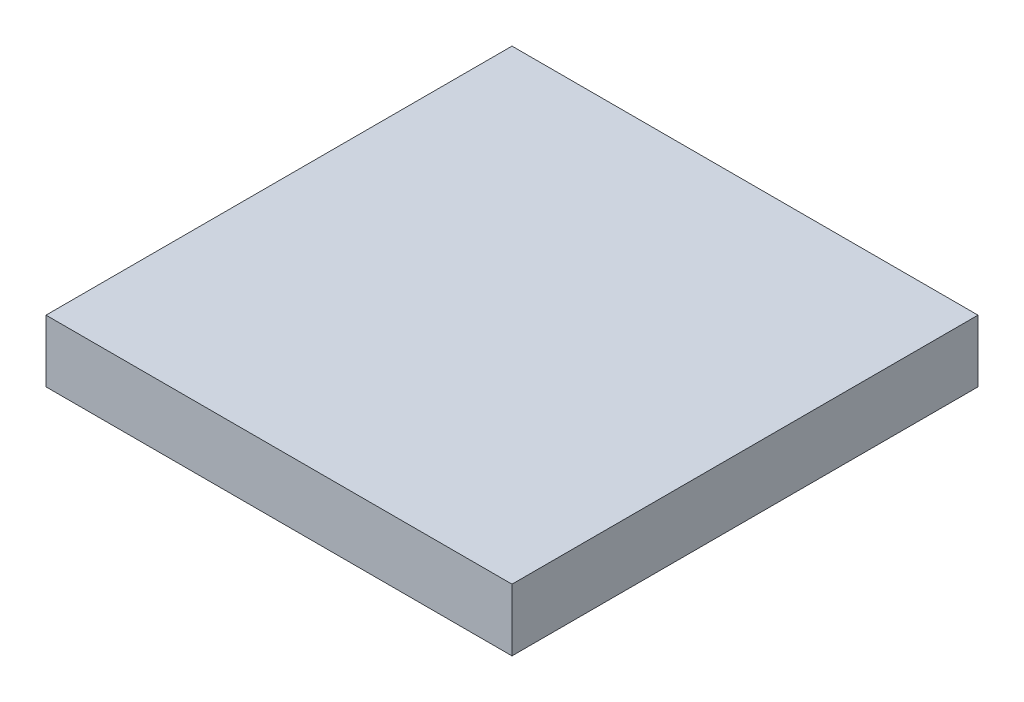
ISO-10303-21;
HEADER;
FILE_DESCRIPTION(('STEP AP214'),'2;1');
FILE_NAME('part.step','',(''),(''),'','','');
FILE_SCHEMA(('AUTOMOTIVE_DESIGN { 1 0 10303 214 1 1 1 1 }'));
ENDSEC;
DATA;
#1=APPLICATION_CONTEXT('core data for automotive mechanical design processes');
#2=APPLICATION_PROTOCOL_DEFINITION('international standard','automotive_design',2000,#1);
#3=PRODUCT_CONTEXT('',#1,'mechanical');
#4=PRODUCT('Part','Part','',(#3));
#5=PRODUCT_RELATED_PRODUCT_CATEGORY('part','',(#4));
#6=PRODUCT_DEFINITION_FORMATION('','',#4);
#7=PRODUCT_DEFINITION_CONTEXT('part definition',#1,'design');
#8=PRODUCT_DEFINITION('design','',#6,#7);
#9=PRODUCT_DEFINITION_SHAPE('','',#8);
#10=(LENGTH_UNIT() NAMED_UNIT(*) SI_UNIT(.MILLI.,.METRE.));
#11=(NAMED_UNIT(*) PLANE_ANGLE_UNIT() SI_UNIT($,.RADIAN.));
#12=(NAMED_UNIT(*) SI_UNIT($,.STERADIAN.) SOLID_ANGLE_UNIT());
#13=UNCERTAINTY_MEASURE_WITH_UNIT(LENGTH_MEASURE(1.E-05),#10,'distance_accuracy_value','');
#14=(GEOMETRIC_REPRESENTATION_CONTEXT(3) GLOBAL_UNCERTAINTY_ASSIGNED_CONTEXT((#13)) GLOBAL_UNIT_ASSIGNED_CONTEXT((#10,
#11,#12)) REPRESENTATION_CONTEXT('',''));
#15=CARTESIAN_POINT('',(0.,0.,0.));
#16=DIRECTION('',(0.,0.,1.));
#17=DIRECTION('',(1.,0.,0.));
#18=AXIS2_PLACEMENT_3D('',#15,#16,#17);
#19=CARTESIAN_POINT('',(15.,2.,15.));
#20=DIRECTION('',(-1.,0.,0.));
#21=DIRECTION('',(0.,0.,1.));
#22=AXIS2_PLACEMENT_3D('',#19,#20,#21);
#23=PLANE('',#22);
#24=DIRECTION('',(0.,0.,-1.));
#25=VECTOR('',#24,1.);
#26=CARTESIAN_POINT('',(15.,-2.,15.));
#27=LINE('',#26,#25);
#28=CARTESIAN_POINT('',(15.,-2.,15.));
#29=VERTEX_POINT('',#28);
#30=CARTESIAN_POINT('',(15.,-2.,-15.));
#31=VERTEX_POINT('',#30);
#32=EDGE_CURVE('E106',#29,#31,#27,.T.);
#33=ORIENTED_EDGE('',*,*,#32,.T.);
#34=DIRECTION('',(0.,-1.,0.));
#35=VECTOR('',#34,1.);
#36=CARTESIAN_POINT('',(15.,2.,-15.));
#37=LINE('',#36,#35);
#38=CARTESIAN_POINT('',(15.,2.,-15.));
#39=VERTEX_POINT('',#38);
#40=EDGE_CURVE('E11',#39,#31,#37,.T.);
#41=ORIENTED_EDGE('',*,*,#40,.F.);
#42=DIRECTION('',(0.,0.,-1.));
#43=VECTOR('',#42,1.);
#44=CARTESIAN_POINT('',(15.,2.,15.));
#45=LINE('',#44,#43);
#46=CARTESIAN_POINT('',(15.,2.,15.));
#47=VERTEX_POINT('',#46);
#48=EDGE_CURVE('E88',#47,#39,#45,.T.);
#49=ORIENTED_EDGE('',*,*,#48,.F.);
#50=DIRECTION('',(0.,-1.,0.));
#51=VECTOR('',#50,1.);
#52=CARTESIAN_POINT('',(15.,2.,15.));
#53=LINE('',#52,#51);
#54=EDGE_CURVE('E102',#47,#29,#53,.T.);
#55=ORIENTED_EDGE('',*,*,#54,.T.);
#56=EDGE_LOOP('',(#33,#41,#49,#55));
#57=FACE_BOUND('',#56,.T.);
#58=ADVANCED_FACE('F36',(#57),#23,.F.);
#59=CARTESIAN_POINT('',(-15.,2.,-15.));
#60=DIRECTION('',(0.,0.,1.));
#61=DIRECTION('',(1.,0.,0.));
#62=AXIS2_PLACEMENT_3D('',#59,#60,#61);
#63=PLANE('',#62);
#64=DIRECTION('',(-1.,0.,0.));
#65=VECTOR('',#64,1.);
#66=CARTESIAN_POINT('',(-15.,-2.,-15.));
#67=LINE('',#66,#65);
#68=CARTESIAN_POINT('',(-15.,-2.,-15.));
#69=VERTEX_POINT('',#68);
#70=EDGE_CURVE('E93',#31,#69,#67,.T.);
#71=ORIENTED_EDGE('',*,*,#70,.T.);
#72=DIRECTION('',(0.,-1.,0.));
#73=VECTOR('',#72,1.);
#74=CARTESIAN_POINT('',(-15.,2.,-15.));
#75=LINE('',#74,#73);
#76=CARTESIAN_POINT('',(-15.,2.,-15.));
#77=VERTEX_POINT('',#76);
#78=EDGE_CURVE('E45',#77,#69,#75,.T.);
#79=ORIENTED_EDGE('',*,*,#78,.F.);
#80=DIRECTION('',(-1.,0.,0.));
#81=VECTOR('',#80,1.);
#82=CARTESIAN_POINT('',(-15.,2.,-15.));
#83=LINE('',#82,#81);
#84=EDGE_CURVE('E83',#39,#77,#83,.T.);
#85=ORIENTED_EDGE('',*,*,#84,.F.);
#86=ORIENTED_EDGE('',*,*,#40,.T.);
#87=EDGE_LOOP('',(#71,#79,#85,#86));
#88=FACE_BOUND('',#87,.T.);
#89=ADVANCED_FACE('F92',(#88),#63,.F.);
#90=CARTESIAN_POINT('',(-15.,2.,15.));
#91=DIRECTION('',(1.,0.,0.));
#92=DIRECTION('',(0.,0.,-1.));
#93=AXIS2_PLACEMENT_3D('',#90,#91,#92);
#94=PLANE('',#93);
#95=DIRECTION('',(0.,0.,1.));
#96=VECTOR('',#95,1.);
#97=CARTESIAN_POINT('',(-15.,-2.,15.));
#98=LINE('',#97,#96);
#99=CARTESIAN_POINT('',(-15.,-2.,15.));
#100=VERTEX_POINT('',#99);
#101=EDGE_CURVE('E70',#69,#100,#98,.T.);
#102=ORIENTED_EDGE('',*,*,#101,.T.);
#103=DIRECTION('',(0.,-1.,0.));
#104=VECTOR('',#103,1.);
#105=CARTESIAN_POINT('',(-15.,2.,15.));
#106=LINE('',#105,#104);
#107=CARTESIAN_POINT('',(-15.,2.,15.));
#108=VERTEX_POINT('',#107);
#109=EDGE_CURVE('E95',#108,#100,#106,.T.);
#110=ORIENTED_EDGE('',*,*,#109,.F.);
#111=DIRECTION('',(0.,0.,1.));
#112=VECTOR('',#111,1.);
#113=CARTESIAN_POINT('',(-15.,2.,15.));
#114=LINE('',#113,#112);
#115=EDGE_CURVE('E86',#77,#108,#114,.T.);
#116=ORIENTED_EDGE('',*,*,#115,.F.);
#117=ORIENTED_EDGE('',*,*,#78,.T.);
#118=EDGE_LOOP('',(#102,#110,#116,#117));
#119=FACE_BOUND('',#118,.T.);
#120=ADVANCED_FACE('F96',(#119),#94,.F.);
#121=CARTESIAN_POINT('',(-15.,2.,15.));
#122=DIRECTION('',(0.,0.,-1.));
#123=DIRECTION('',(-1.,0.,0.));
#124=AXIS2_PLACEMENT_3D('',#121,#122,#123);
#125=PLANE('',#124);
#126=DIRECTION('',(1.,0.,0.));
#127=VECTOR('',#126,1.);
#128=CARTESIAN_POINT('',(-15.,-2.,15.));
#129=LINE('',#128,#127);
#130=EDGE_CURVE('E76',#100,#29,#129,.T.);
#131=ORIENTED_EDGE('',*,*,#130,.T.);
#132=ORIENTED_EDGE('',*,*,#54,.F.);
#133=DIRECTION('',(1.,0.,0.));
#134=VECTOR('',#133,1.);
#135=CARTESIAN_POINT('',(-15.,2.,15.));
#136=LINE('',#135,#134);
#137=EDGE_CURVE('E53',#108,#47,#136,.T.);
#138=ORIENTED_EDGE('',*,*,#137,.F.);
#139=ORIENTED_EDGE('',*,*,#109,.T.);
#140=EDGE_LOOP('',(#131,#132,#138,#139));
#141=FACE_BOUND('',#140,.T.);
#142=ADVANCED_FACE('F117',(#141),#125,.F.);
#143=CARTESIAN_POINT('',(0.,2.,0.));
#144=DIRECTION('',(0.,-1.,0.));
#145=DIRECTION('',(0.,0.,-1.));
#146=AXIS2_PLACEMENT_3D('',#143,#144,#145);
#147=PLANE('',#146);
#148=ORIENTED_EDGE('',*,*,#48,.T.);
#149=ORIENTED_EDGE('',*,*,#84,.T.);
#150=ORIENTED_EDGE('',*,*,#115,.T.);
#151=ORIENTED_EDGE('',*,*,#137,.T.);
#152=EDGE_LOOP('',(#148,#149,#150,#151));
#153=FACE_BOUND('',#152,.T.);
#154=ADVANCED_FACE('F84',(#153),#147,.F.);
#155=CARTESIAN_POINT('',(0.,-2.,0.));
#156=DIRECTION('',(0.,-1.,0.));
#157=DIRECTION('',(0.,0.,-1.));
#158=AXIS2_PLACEMENT_3D('',#155,#156,#157);
#159=PLANE('',#158);
#160=ORIENTED_EDGE('',*,*,#32,.F.);
#161=ORIENTED_EDGE('',*,*,#130,.F.);
#162=ORIENTED_EDGE('',*,*,#101,.F.);
#163=ORIENTED_EDGE('',*,*,#70,.F.);
#164=EDGE_LOOP('',(#160,#161,#162,#163));
#165=FACE_BOUND('',#164,.T.);
#166=ADVANCED_FACE('F120',(#165),#159,.T.);
#167=CLOSED_SHELL('',(#58,#89,#120,#142,#154,#166));
#168=MANIFOLD_SOLID_BREP('B2',#167);
#169=ADVANCED_BREP_SHAPE_REPRESENTATION('',(#18,#168),#14);
#170=SHAPE_DEFINITION_REPRESENTATION(#9,#169);
ENDSEC;
END-ISO-10303-21;
